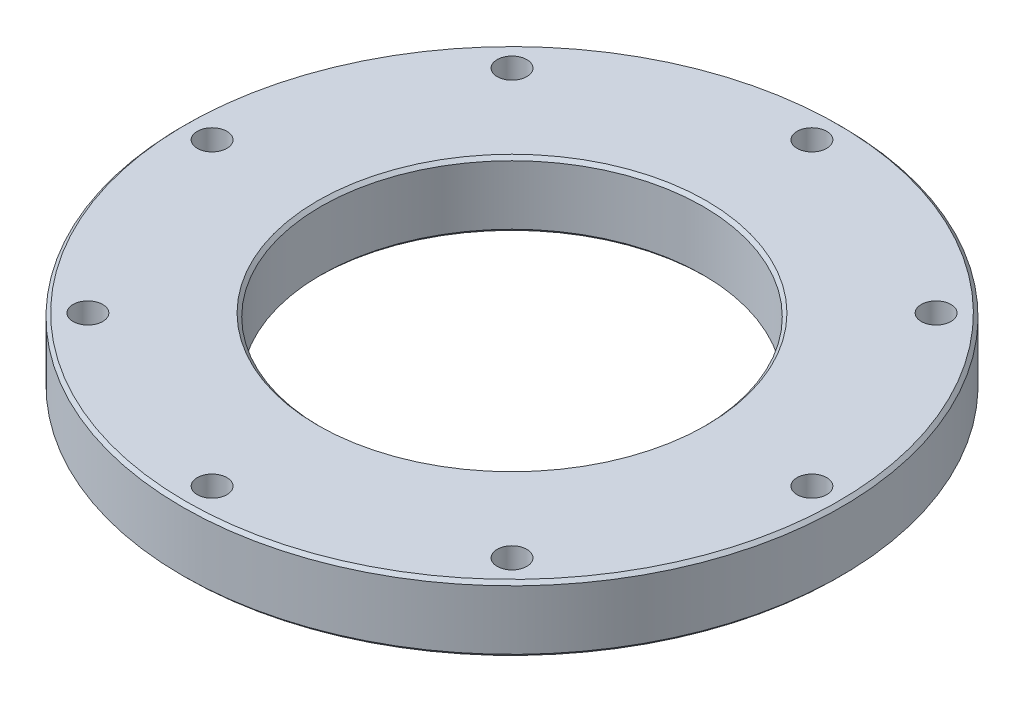
ISO-10303-21;
HEADER;
FILE_DESCRIPTION(('STEP AP214'),'2;1');
FILE_NAME('part.step','',(''),(''),'','','');
FILE_SCHEMA(('AUTOMOTIVE_DESIGN { 1 0 10303 214 1 1 1 1 }'));
ENDSEC;
DATA;
#1=APPLICATION_CONTEXT('core data for automotive mechanical design processes');
#2=APPLICATION_PROTOCOL_DEFINITION('international standard','automotive_design',2000,#1);
#3=PRODUCT_CONTEXT('',#1,'mechanical');
#4=PRODUCT('Part','Part','',(#3));
#5=PRODUCT_RELATED_PRODUCT_CATEGORY('part','',(#4));
#6=PRODUCT_DEFINITION_FORMATION('','',#4);
#7=PRODUCT_DEFINITION_CONTEXT('part definition',#1,'design');
#8=PRODUCT_DEFINITION('design','',#6,#7);
#9=PRODUCT_DEFINITION_SHAPE('','',#8);
#10=(LENGTH_UNIT() NAMED_UNIT(*) SI_UNIT(.MILLI.,.METRE.));
#11=(NAMED_UNIT(*) PLANE_ANGLE_UNIT() SI_UNIT($,.RADIAN.));
#12=(NAMED_UNIT(*) SI_UNIT($,.STERADIAN.) SOLID_ANGLE_UNIT());
#13=UNCERTAINTY_MEASURE_WITH_UNIT(LENGTH_MEASURE(1.E-05),#10,'distance_accuracy_value','');
#14=(GEOMETRIC_REPRESENTATION_CONTEXT(3) GLOBAL_UNCERTAINTY_ASSIGNED_CONTEXT((#13)) GLOBAL_UNIT_ASSIGNED_CONTEXT((#10,
#11,#12)) REPRESENTATION_CONTEXT('',''));
#15=CARTESIAN_POINT('',(0.,0.,0.));
#16=DIRECTION('',(0.,0.,1.));
#17=DIRECTION('',(1.,0.,0.));
#18=AXIS2_PLACEMENT_3D('',#15,#16,#17);
#19=CARTESIAN_POINT('',(0.,10.,0.));
#20=DIRECTION('',(0.,1.,0.));
#21=DIRECTION('',(0.,0.,1.));
#22=AXIS2_PLACEMENT_3D('',#19,#20,#21);
#23=PLANE('',#22);
#24=CARTESIAN_POINT('',(0.,10.,0.));
#25=DIRECTION('',(0.,1.,0.));
#26=DIRECTION('',(0.,0.,1.));
#27=AXIS2_PLACEMENT_3D('',#24,#25,#26);
#28=CIRCLE('',#27,29.5);
#29=CARTESIAN_POINT('',(0.,10.,29.5));
#30=VERTEX_POINT('',#29);
#31=EDGE_CURVE('E56',#30,#30,#28,.F.);
#32=ORIENTED_EDGE('',*,*,#31,.T.);
#33=EDGE_LOOP('',(#32));
#34=FACE_BOUND('',#33,.T.);
#35=CARTESIAN_POINT('',(0.,10.,0.));
#36=DIRECTION('',(0.,1.,0.));
#37=DIRECTION('',(0.,0.,1.));
#38=AXIS2_PLACEMENT_3D('',#35,#36,#37);
#39=CIRCLE('',#38,49.5);
#40=CARTESIAN_POINT('',(0.,10.,49.5));
#41=VERTEX_POINT('',#40);
#42=EDGE_CURVE('E59',#41,#41,#39,.T.);
#43=ORIENTED_EDGE('',*,*,#42,.T.);
#44=EDGE_LOOP('',(#43));
#45=FACE_BOUND('',#44,.T.);
#46=CARTESIAN_POINT('',(-45.4999999999991,10.,9.09095453601933E-13));
#47=DIRECTION('',(0.,1.,0.));
#48=DIRECTION('',(0.,0.,1.));
#49=AXIS2_PLACEMENT_3D('',#46,#47,#48);
#50=CIRCLE('',#49,2.25);
#51=CARTESIAN_POINT('',(-45.4999999999991,10.,2.25000000000091));
#52=VERTEX_POINT('',#51);
#53=EDGE_CURVE('E102',#52,#52,#50,.T.);
#54=ORIENTED_EDGE('',*,*,#53,.F.);
#55=EDGE_LOOP('',(#54));
#56=FACE_BOUND('',#55,.T.);
#57=CARTESIAN_POINT('',(1.80704662133162E-12,10.,45.5));
#58=DIRECTION('',(0.,1.,0.));
#59=DIRECTION('',(0.,0.,1.));
#60=AXIS2_PLACEMENT_3D('',#57,#58,#59);
#61=CIRCLE('',#60,2.25);
#62=CARTESIAN_POINT('',(1.80704662133162E-12,10.,47.75));
#63=VERTEX_POINT('',#62);
#64=EDGE_CURVE('E90',#63,#63,#61,.T.);
#65=ORIENTED_EDGE('',*,*,#64,.F.);
#66=EDGE_LOOP('',(#65));
#67=FACE_BOUND('',#66,.T.);
#68=CARTESIAN_POINT('',(45.5000000000009,10.,-9.03523310665812E-13));
#69=DIRECTION('',(0.,1.,0.));
#70=DIRECTION('',(0.,0.,1.));
#71=AXIS2_PLACEMENT_3D('',#68,#69,#70);
#72=CIRCLE('',#71,2.25);
#73=CARTESIAN_POINT('',(45.5000000000009,10.,2.2499999999991));
#74=VERTEX_POINT('',#73);
#75=EDGE_CURVE('E78',#74,#74,#72,.T.);
#76=ORIENTED_EDGE('',*,*,#75,.F.);
#77=EDGE_LOOP('',(#76));
#78=FACE_BOUND('',#77,.T.);
#79=CARTESIAN_POINT('',(0.,10.,-45.5));
#80=DIRECTION('',(0.,1.,0.));
#81=DIRECTION('',(0.,0.,1.));
#82=AXIS2_PLACEMENT_3D('',#79,#80,#81);
#83=CIRCLE('',#82,2.25);
#84=CARTESIAN_POINT('',(0.,10.,-43.25));
#85=VERTEX_POINT('',#84);
#86=EDGE_CURVE('E68',#85,#85,#83,.T.);
#87=ORIENTED_EDGE('',*,*,#86,.F.);
#88=EDGE_LOOP('',(#87));
#89=FACE_BOUND('',#88,.T.);
#90=CARTESIAN_POINT('',(32.1733585439882,10.,-32.1733585439886));
#91=DIRECTION('',(0.,1.,0.));
#92=DIRECTION('',(0.,0.,1.));
#93=AXIS2_PLACEMENT_3D('',#90,#91,#92);
#94=CIRCLE('',#93,2.25);
#95=CARTESIAN_POINT('',(32.1733585439882,10.,-29.9233585439886));
#96=VERTEX_POINT('',#95);
#97=EDGE_CURVE('E72',#96,#96,#94,.T.);
#98=ORIENTED_EDGE('',*,*,#97,.F.);
#99=EDGE_LOOP('',(#98));
#100=FACE_BOUND('',#99,.T.);
#101=CARTESIAN_POINT('',(32.1733585439895,10.,32.1733585439873));
#102=DIRECTION('',(0.,1.,0.));
#103=DIRECTION('',(0.,0.,1.));
#104=AXIS2_PLACEMENT_3D('',#101,#102,#103);
#105=CIRCLE('',#104,2.25);
#106=CARTESIAN_POINT('',(32.1733585439895,10.,34.4233585439873));
#107=VERTEX_POINT('',#106);
#108=EDGE_CURVE('E84',#107,#107,#105,.T.);
#109=ORIENTED_EDGE('',*,*,#108,.F.);
#110=EDGE_LOOP('',(#109));
#111=FACE_BOUND('',#110,.T.);
#112=CARTESIAN_POINT('',(-32.1733585439864,10.,32.1733585439886));
#113=DIRECTION('',(0.,1.,0.));
#114=DIRECTION('',(0.,0.,1.));
#115=AXIS2_PLACEMENT_3D('',#112,#113,#114);
#116=CIRCLE('',#115,2.25);
#117=CARTESIAN_POINT('',(-32.1733585439864,10.,34.4233585439886));
#118=VERTEX_POINT('',#117);
#119=EDGE_CURVE('E96',#118,#118,#116,.T.);
#120=ORIENTED_EDGE('',*,*,#119,.F.);
#121=EDGE_LOOP('',(#120));
#122=FACE_BOUND('',#121,.T.);
#123=CARTESIAN_POINT('',(-32.1733585439877,10.,-32.1733585439873));
#124=DIRECTION('',(0.,1.,0.));
#125=DIRECTION('',(0.,0.,1.));
#126=AXIS2_PLACEMENT_3D('',#123,#124,#125);
#127=CIRCLE('',#126,2.25);
#128=CARTESIAN_POINT('',(-32.1733585439877,10.,-29.9233585439873));
#129=VERTEX_POINT('',#128);
#130=EDGE_CURVE('E108',#129,#129,#127,.T.);
#131=ORIENTED_EDGE('',*,*,#130,.F.);
#132=EDGE_LOOP('',(#131));
#133=FACE_BOUND('',#132,.T.);
#134=ADVANCED_FACE('F35',(#34,#45,#56,#67,#78,#89,#100,#111,#122,#133),#23,.T.);
#135=CARTESIAN_POINT('',(0.,0.,0.));
#136=DIRECTION('',(0.,1.,0.));
#137=DIRECTION('',(0.,0.,1.));
#138=AXIS2_PLACEMENT_3D('',#135,#136,#137);
#139=PLANE('',#138);
#140=CARTESIAN_POINT('',(0.,0.,0.));
#141=DIRECTION('',(0.,1.,0.));
#142=DIRECTION('',(0.,0.,1.));
#143=AXIS2_PLACEMENT_3D('',#140,#141,#142);
#144=CIRCLE('',#143,29.5);
#145=CARTESIAN_POINT('',(0.,0.,29.5));
#146=VERTEX_POINT('',#145);
#147=EDGE_CURVE('E47',#146,#146,#144,.T.);
#148=ORIENTED_EDGE('',*,*,#147,.T.);
#149=EDGE_LOOP('',(#148));
#150=FACE_BOUND('',#149,.T.);
#151=CARTESIAN_POINT('',(0.,0.,0.));
#152=DIRECTION('',(0.,1.,0.));
#153=DIRECTION('',(0.,0.,1.));
#154=AXIS2_PLACEMENT_3D('',#151,#152,#153);
#155=CIRCLE('',#154,49.5);
#156=CARTESIAN_POINT('',(0.,0.,49.5));
#157=VERTEX_POINT('',#156);
#158=EDGE_CURVE('E51',#157,#157,#155,.F.);
#159=ORIENTED_EDGE('',*,*,#158,.T.);
#160=EDGE_LOOP('',(#159));
#161=FACE_BOUND('',#160,.T.);
#162=CARTESIAN_POINT('',(0.,0.,-45.5));
#163=DIRECTION('',(0.,1.,0.));
#164=DIRECTION('',(0.,0.,1.));
#165=AXIS2_PLACEMENT_3D('',#162,#163,#164);
#166=CIRCLE('',#165,2.25);
#167=CARTESIAN_POINT('',(0.,0.,-43.25));
#168=VERTEX_POINT('',#167);
#169=EDGE_CURVE('E69',#168,#168,#166,.T.);
#170=ORIENTED_EDGE('',*,*,#169,.T.);
#171=EDGE_LOOP('',(#170));
#172=FACE_BOUND('',#171,.T.);
#173=CARTESIAN_POINT('',(32.1733585439882,0.,-32.1733585439886));
#174=DIRECTION('',(0.,1.,0.));
#175=DIRECTION('',(0.,0.,1.));
#176=AXIS2_PLACEMENT_3D('',#173,#174,#175);
#177=CIRCLE('',#176,2.25);
#178=CARTESIAN_POINT('',(32.1733585439882,0.,-29.9233585439886));
#179=VERTEX_POINT('',#178);
#180=EDGE_CURVE('E75',#179,#179,#177,.T.);
#181=ORIENTED_EDGE('',*,*,#180,.T.);
#182=EDGE_LOOP('',(#181));
#183=FACE_BOUND('',#182,.T.);
#184=CARTESIAN_POINT('',(45.5000000000009,0.,-9.03523310665812E-13));
#185=DIRECTION('',(0.,1.,0.));
#186=DIRECTION('',(0.,0.,1.));
#187=AXIS2_PLACEMENT_3D('',#184,#185,#186);
#188=CIRCLE('',#187,2.25);
#189=CARTESIAN_POINT('',(45.5000000000009,0.,2.2499999999991));
#190=VERTEX_POINT('',#189);
#191=EDGE_CURVE('E81',#190,#190,#188,.T.);
#192=ORIENTED_EDGE('',*,*,#191,.T.);
#193=EDGE_LOOP('',(#192));
#194=FACE_BOUND('',#193,.T.);
#195=CARTESIAN_POINT('',(32.1733585439895,0.,32.1733585439873));
#196=DIRECTION('',(0.,1.,0.));
#197=DIRECTION('',(0.,0.,1.));
#198=AXIS2_PLACEMENT_3D('',#195,#196,#197);
#199=CIRCLE('',#198,2.25);
#200=CARTESIAN_POINT('',(32.1733585439895,0.,34.4233585439873));
#201=VERTEX_POINT('',#200);
#202=EDGE_CURVE('E87',#201,#201,#199,.T.);
#203=ORIENTED_EDGE('',*,*,#202,.T.);
#204=EDGE_LOOP('',(#203));
#205=FACE_BOUND('',#204,.T.);
#206=CARTESIAN_POINT('',(1.80704662133162E-12,0.,45.5));
#207=DIRECTION('',(0.,1.,0.));
#208=DIRECTION('',(0.,0.,1.));
#209=AXIS2_PLACEMENT_3D('',#206,#207,#208);
#210=CIRCLE('',#209,2.25);
#211=CARTESIAN_POINT('',(1.80704662133162E-12,0.,47.75));
#212=VERTEX_POINT('',#211);
#213=EDGE_CURVE('E93',#212,#212,#210,.T.);
#214=ORIENTED_EDGE('',*,*,#213,.T.);
#215=EDGE_LOOP('',(#214));
#216=FACE_BOUND('',#215,.T.);
#217=CARTESIAN_POINT('',(-32.1733585439864,0.,32.1733585439886));
#218=DIRECTION('',(0.,1.,0.));
#219=DIRECTION('',(0.,0.,1.));
#220=AXIS2_PLACEMENT_3D('',#217,#218,#219);
#221=CIRCLE('',#220,2.25);
#222=CARTESIAN_POINT('',(-32.1733585439864,0.,34.4233585439886));
#223=VERTEX_POINT('',#222);
#224=EDGE_CURVE('E99',#223,#223,#221,.T.);
#225=ORIENTED_EDGE('',*,*,#224,.T.);
#226=EDGE_LOOP('',(#225));
#227=FACE_BOUND('',#226,.T.);
#228=CARTESIAN_POINT('',(-45.4999999999991,0.,9.09095453601933E-13));
#229=DIRECTION('',(0.,1.,0.));
#230=DIRECTION('',(0.,0.,1.));
#231=AXIS2_PLACEMENT_3D('',#228,#229,#230);
#232=CIRCLE('',#231,2.25);
#233=CARTESIAN_POINT('',(-45.4999999999991,0.,2.25000000000091));
#234=VERTEX_POINT('',#233);
#235=EDGE_CURVE('E105',#234,#234,#232,.T.);
#236=ORIENTED_EDGE('',*,*,#235,.T.);
#237=EDGE_LOOP('',(#236));
#238=FACE_BOUND('',#237,.T.);
#239=CARTESIAN_POINT('',(-32.1733585439877,0.,-32.1733585439873));
#240=DIRECTION('',(0.,1.,0.));
#241=DIRECTION('',(0.,0.,1.));
#242=AXIS2_PLACEMENT_3D('',#239,#240,#241);
#243=CIRCLE('',#242,2.25);
#244=CARTESIAN_POINT('',(-32.1733585439877,0.,-29.9233585439873));
#245=VERTEX_POINT('',#244);
#246=EDGE_CURVE('E111',#245,#245,#243,.T.);
#247=ORIENTED_EDGE('',*,*,#246,.T.);
#248=EDGE_LOOP('',(#247));
#249=FACE_BOUND('',#248,.T.);
#250=ADVANCED_FACE('F121',(#150,#161,#172,#183,#194,#205,#216,#227,#238,#249),#139,.F.);
#251=CARTESIAN_POINT('',(0.,10.,0.));
#252=DIRECTION('',(0.,-1.,0.));
#253=DIRECTION('',(0.,0.,-1.));
#254=AXIS2_PLACEMENT_3D('',#251,#252,#253);
#255=CYLINDRICAL_SURFACE('',#254,50.);
#256=CARTESIAN_POINT('',(0.,9.50000000000002,0.));
#257=DIRECTION('',(0.,1.,0.));
#258=DIRECTION('',(0.,0.,1.));
#259=AXIS2_PLACEMENT_3D('',#256,#257,#258);
#260=CIRCLE('',#259,50.);
#261=CARTESIAN_POINT('',(0.,9.50000000000002,50.));
#262=VERTEX_POINT('',#261);
#263=EDGE_CURVE('E10',#262,#262,#260,.F.);
#264=ORIENTED_EDGE('',*,*,#263,.T.);
#265=EDGE_LOOP('',(#264));
#266=FACE_BOUND('',#265,.T.);
#267=CARTESIAN_POINT('',(0.,0.499999999999994,0.));
#268=DIRECTION('',(0.,1.,0.));
#269=DIRECTION('',(0.,0.,1.));
#270=AXIS2_PLACEMENT_3D('',#267,#268,#269);
#271=CIRCLE('',#270,50.);
#272=CARTESIAN_POINT('',(0.,0.499999999999994,50.));
#273=VERTEX_POINT('',#272);
#274=EDGE_CURVE('E43',#273,#273,#271,.T.);
#275=ORIENTED_EDGE('',*,*,#274,.T.);
#276=EDGE_LOOP('',(#275));
#277=FACE_BOUND('',#276,.T.);
#278=ADVANCED_FACE('F127',(#266,#277),#255,.T.);
#279=CARTESIAN_POINT('',(0.,10.,-45.5));
#280=DIRECTION('',(0.,-1.,0.));
#281=DIRECTION('',(0.,0.,-1.));
#282=AXIS2_PLACEMENT_3D('',#279,#280,#281);
#283=CYLINDRICAL_SURFACE('',#282,2.25);
#284=ORIENTED_EDGE('',*,*,#86,.T.);
#285=EDGE_LOOP('',(#284));
#286=FACE_BOUND('',#285,.T.);
#287=ORIENTED_EDGE('',*,*,#169,.F.);
#288=EDGE_LOOP('',(#287));
#289=FACE_BOUND('',#288,.T.);
#290=ADVANCED_FACE('F132',(#286,#289),#283,.F.);
#291=CARTESIAN_POINT('',(0.,10.,0.));
#292=DIRECTION('',(0.,-1.,0.));
#293=DIRECTION('',(0.,0.,-1.));
#294=AXIS2_PLACEMENT_3D('',#291,#292,#293);
#295=CYLINDRICAL_SURFACE('',#294,29.);
#296=CARTESIAN_POINT('',(0.,9.5,0.));
#297=DIRECTION('',(0.,1.,0.));
#298=DIRECTION('',(0.,0.,1.));
#299=AXIS2_PLACEMENT_3D('',#296,#297,#298);
#300=CIRCLE('',#299,29.);
#301=CARTESIAN_POINT('',(0.,9.5,29.));
#302=VERTEX_POINT('',#301);
#303=EDGE_CURVE('E62',#302,#302,#300,.T.);
#304=ORIENTED_EDGE('',*,*,#303,.T.);
#305=EDGE_LOOP('',(#304));
#306=FACE_BOUND('',#305,.T.);
#307=CARTESIAN_POINT('',(0.,0.5,0.));
#308=DIRECTION('',(0.,1.,0.));
#309=DIRECTION('',(0.,0.,1.));
#310=AXIS2_PLACEMENT_3D('',#307,#308,#309);
#311=CIRCLE('',#310,29.);
#312=CARTESIAN_POINT('',(0.,0.5,29.));
#313=VERTEX_POINT('',#312);
#314=EDGE_CURVE('E65',#313,#313,#311,.F.);
#315=ORIENTED_EDGE('',*,*,#314,.T.);
#316=EDGE_LOOP('',(#315));
#317=FACE_BOUND('',#316,.T.);
#318=ADVANCED_FACE('F210',(#306,#317),#295,.F.);
#319=CARTESIAN_POINT('',(32.1733585439882,10.,-32.1733585439886));
#320=DIRECTION('',(0.,-1.,0.));
#321=DIRECTION('',(0.,0.,-1.));
#322=AXIS2_PLACEMENT_3D('',#319,#320,#321);
#323=CYLINDRICAL_SURFACE('',#322,2.25);
#324=ORIENTED_EDGE('',*,*,#97,.T.);
#325=EDGE_LOOP('',(#324));
#326=FACE_BOUND('',#325,.T.);
#327=ORIENTED_EDGE('',*,*,#180,.F.);
#328=EDGE_LOOP('',(#327));
#329=FACE_BOUND('',#328,.T.);
#330=ADVANCED_FACE('F207',(#326,#329),#323,.F.);
#331=CARTESIAN_POINT('',(45.5000000000009,10.,-9.03523310665812E-13));
#332=DIRECTION('',(0.,-1.,0.));
#333=DIRECTION('',(0.,0.,-1.));
#334=AXIS2_PLACEMENT_3D('',#331,#332,#333);
#335=CYLINDRICAL_SURFACE('',#334,2.25);
#336=ORIENTED_EDGE('',*,*,#75,.T.);
#337=EDGE_LOOP('',(#336));
#338=FACE_BOUND('',#337,.T.);
#339=ORIENTED_EDGE('',*,*,#191,.F.);
#340=EDGE_LOOP('',(#339));
#341=FACE_BOUND('',#340,.T.);
#342=ADVANCED_FACE('F203',(#338,#341),#335,.F.);
#343=CARTESIAN_POINT('',(32.1733585439895,10.,32.1733585439873));
#344=DIRECTION('',(0.,-1.,0.));
#345=DIRECTION('',(0.,0.,-1.));
#346=AXIS2_PLACEMENT_3D('',#343,#344,#345);
#347=CYLINDRICAL_SURFACE('',#346,2.25);
#348=ORIENTED_EDGE('',*,*,#108,.T.);
#349=EDGE_LOOP('',(#348));
#350=FACE_BOUND('',#349,.T.);
#351=ORIENTED_EDGE('',*,*,#202,.F.);
#352=EDGE_LOOP('',(#351));
#353=FACE_BOUND('',#352,.T.);
#354=ADVANCED_FACE('F199',(#350,#353),#347,.F.);
#355=CARTESIAN_POINT('',(1.80704662133162E-12,10.,45.5));
#356=DIRECTION('',(0.,-1.,0.));
#357=DIRECTION('',(0.,0.,-1.));
#358=AXIS2_PLACEMENT_3D('',#355,#356,#357);
#359=CYLINDRICAL_SURFACE('',#358,2.25);
#360=ORIENTED_EDGE('',*,*,#64,.T.);
#361=EDGE_LOOP('',(#360));
#362=FACE_BOUND('',#361,.T.);
#363=ORIENTED_EDGE('',*,*,#213,.F.);
#364=EDGE_LOOP('',(#363));
#365=FACE_BOUND('',#364,.T.);
#366=ADVANCED_FACE('F181',(#362,#365),#359,.F.);
#367=CARTESIAN_POINT('',(-32.1733585439864,10.,32.1733585439886));
#368=DIRECTION('',(0.,-1.,0.));
#369=DIRECTION('',(0.,0.,-1.));
#370=AXIS2_PLACEMENT_3D('',#367,#368,#369);
#371=CYLINDRICAL_SURFACE('',#370,2.25);
#372=ORIENTED_EDGE('',*,*,#119,.T.);
#373=EDGE_LOOP('',(#372));
#374=FACE_BOUND('',#373,.T.);
#375=ORIENTED_EDGE('',*,*,#224,.F.);
#376=EDGE_LOOP('',(#375));
#377=FACE_BOUND('',#376,.T.);
#378=ADVANCED_FACE('F177',(#374,#377),#371,.F.);
#379=CARTESIAN_POINT('',(-45.4999999999991,10.,9.09095453601933E-13));
#380=DIRECTION('',(0.,-1.,0.));
#381=DIRECTION('',(0.,0.,-1.));
#382=AXIS2_PLACEMENT_3D('',#379,#380,#381);
#383=CYLINDRICAL_SURFACE('',#382,2.25);
#384=ORIENTED_EDGE('',*,*,#53,.T.);
#385=EDGE_LOOP('',(#384));
#386=FACE_BOUND('',#385,.T.);
#387=ORIENTED_EDGE('',*,*,#235,.F.);
#388=EDGE_LOOP('',(#387));
#389=FACE_BOUND('',#388,.T.);
#390=ADVANCED_FACE('F180',(#386,#389),#383,.F.);
#391=CARTESIAN_POINT('',(-32.1733585439877,10.,-32.1733585439873));
#392=DIRECTION('',(0.,-1.,0.));
#393=DIRECTION('',(0.,0.,-1.));
#394=AXIS2_PLACEMENT_3D('',#391,#392,#393);
#395=CYLINDRICAL_SURFACE('',#394,2.25);
#396=ORIENTED_EDGE('',*,*,#130,.T.);
#397=EDGE_LOOP('',(#396));
#398=FACE_BOUND('',#397,.T.);
#399=ORIENTED_EDGE('',*,*,#246,.F.);
#400=EDGE_LOOP('',(#399));
#401=FACE_BOUND('',#400,.T.);
#402=ADVANCED_FACE('F117',(#398,#401),#395,.F.);
#403=CARTESIAN_POINT('',(0.,9.5,0.));
#404=DIRECTION('',(0.,1.,0.));
#405=DIRECTION('',(0.,0.,1.));
#406=AXIS2_PLACEMENT_3D('',#403,#404,#405);
#407=CONICAL_SURFACE('',#406,29.,0.785398163397452);
#408=ORIENTED_EDGE('',*,*,#31,.F.);
#409=EDGE_LOOP('',(#408));
#410=FACE_BOUND('',#409,.T.);
#411=ORIENTED_EDGE('',*,*,#303,.F.);
#412=EDGE_LOOP('',(#411));
#413=FACE_BOUND('',#412,.T.);
#414=ADVANCED_FACE('F138',(#410,#413),#407,.F.);
#415=CARTESIAN_POINT('',(0.,0.,0.));
#416=DIRECTION('',(0.,-1.,0.));
#417=DIRECTION('',(0.,0.,-1.));
#418=AXIS2_PLACEMENT_3D('',#415,#416,#417);
#419=CONICAL_SURFACE('',#418,29.5,0.785398163397448);
#420=ORIENTED_EDGE('',*,*,#314,.F.);
#421=EDGE_LOOP('',(#420));
#422=FACE_BOUND('',#421,.T.);
#423=ORIENTED_EDGE('',*,*,#147,.F.);
#424=EDGE_LOOP('',(#423));
#425=FACE_BOUND('',#424,.T.);
#426=ADVANCED_FACE('F144',(#422,#425),#419,.F.);
#427=CARTESIAN_POINT('',(0.,10.,0.));
#428=DIRECTION('',(0.,-1.,0.));
#429=DIRECTION('',(0.,0.,-1.));
#430=AXIS2_PLACEMENT_3D('',#427,#428,#429);
#431=CONICAL_SURFACE('',#430,49.5,0.785398163397469);
#432=ORIENTED_EDGE('',*,*,#263,.F.);
#433=EDGE_LOOP('',(#432));
#434=FACE_BOUND('',#433,.T.);
#435=ORIENTED_EDGE('',*,*,#42,.F.);
#436=EDGE_LOOP('',(#435));
#437=FACE_BOUND('',#436,.T.);
#438=ADVANCED_FACE('F150',(#434,#437),#431,.T.);
#439=CARTESIAN_POINT('',(0.,0.499999999999994,0.));
#440=DIRECTION('',(0.,1.,0.));
#441=DIRECTION('',(0.,0.,1.));
#442=AXIS2_PLACEMENT_3D('',#439,#440,#441);
#443=CONICAL_SURFACE('',#442,50.,0.785398163397448);
#444=ORIENTED_EDGE('',*,*,#158,.F.);
#445=EDGE_LOOP('',(#444));
#446=FACE_BOUND('',#445,.T.);
#447=ORIENTED_EDGE('',*,*,#274,.F.);
#448=EDGE_LOOP('',(#447));
#449=FACE_BOUND('',#448,.T.);
#450=ADVANCED_FACE('F38',(#446,#449),#443,.T.);
#451=CLOSED_SHELL('',(#134,#250,#278,#290,#318,#330,#342,#354,#366,#378,#390,#402,#414,#426,
#438,#450));
#452=MANIFOLD_SOLID_BREP('B2',#451);
#453=ADVANCED_BREP_SHAPE_REPRESENTATION('',(#18,#452),#14);
#454=SHAPE_DEFINITION_REPRESENTATION(#9,#453);
ENDSEC;
END-ISO-10303-21;
